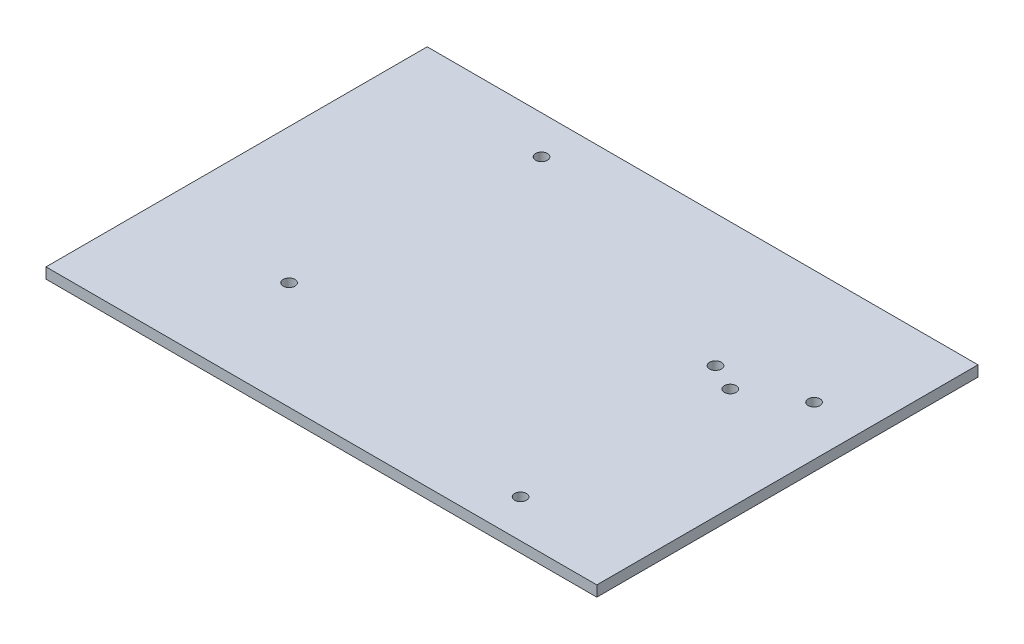
ISO-10303-21;
HEADER;
FILE_DESCRIPTION(('STEP AP214'),'2;1');
FILE_NAME('part.step','',(''),(''),'','','');
FILE_SCHEMA(('AUTOMOTIVE_DESIGN { 1 0 10303 214 1 1 1 1 }'));
ENDSEC;
DATA;
#1=APPLICATION_CONTEXT('core data for automotive mechanical design processes');
#2=APPLICATION_PROTOCOL_DEFINITION('international standard','automotive_design',2000,#1);
#3=PRODUCT_CONTEXT('',#1,'mechanical');
#4=PRODUCT('Part','Part','',(#3));
#5=PRODUCT_RELATED_PRODUCT_CATEGORY('part','',(#4));
#6=PRODUCT_DEFINITION_FORMATION('','',#4);
#7=PRODUCT_DEFINITION_CONTEXT('part definition',#1,'design');
#8=PRODUCT_DEFINITION('design','',#6,#7);
#9=PRODUCT_DEFINITION_SHAPE('','',#8);
#10=(LENGTH_UNIT() NAMED_UNIT(*) SI_UNIT(.MILLI.,.METRE.));
#11=(NAMED_UNIT(*) PLANE_ANGLE_UNIT() SI_UNIT($,.RADIAN.));
#12=(NAMED_UNIT(*) SI_UNIT($,.STERADIAN.) SOLID_ANGLE_UNIT());
#13=UNCERTAINTY_MEASURE_WITH_UNIT(LENGTH_MEASURE(1.E-05),#10,'distance_accuracy_value','');
#14=(GEOMETRIC_REPRESENTATION_CONTEXT(3) GLOBAL_UNCERTAINTY_ASSIGNED_CONTEXT((#13)) GLOBAL_UNIT_ASSIGNED_CONTEXT((#10,
#11,#12)) REPRESENTATION_CONTEXT('',''));
#15=CARTESIAN_POINT('',(0.,0.,0.));
#16=DIRECTION('',(0.,0.,1.));
#17=DIRECTION('',(1.,0.,0.));
#18=AXIS2_PLACEMENT_3D('',#15,#16,#17);
#19=CARTESIAN_POINT('',(0.,2.8,0.));
#20=DIRECTION('',(0.,-1.,0.));
#21=DIRECTION('',(0.,0.,-1.));
#22=AXIS2_PLACEMENT_3D('',#19,#20,#21);
#23=PLANE('',#22);
#24=CARTESIAN_POINT('',(37.9995377037068,2.8,-15.3809460939256));
#25=DIRECTION('',(0.,1.,0.));
#26=DIRECTION('',(0.,0.,1.));
#27=AXIS2_PLACEMENT_3D('',#24,#25,#26);
#28=CIRCLE('',#27,1.55);
#29=CARTESIAN_POINT('',(37.9995377037068,2.8,-13.8309460939256));
#30=VERTEX_POINT('',#29);
#31=EDGE_CURVE('E133',#30,#30,#28,.T.);
#32=ORIENTED_EDGE('',*,*,#31,.F.);
#33=EDGE_LOOP('',(#32));
#34=FACE_BOUND('',#33,.T.);
#35=CARTESIAN_POINT('',(45.25,2.8,-12.));
#36=DIRECTION('',(0.,1.,0.));
#37=DIRECTION('',(0.,0.,1.));
#38=AXIS2_PLACEMENT_3D('',#35,#36,#37);
#39=CIRCLE('',#38,1.55);
#40=CARTESIAN_POINT('',(45.25,2.8,-10.45));
#41=VERTEX_POINT('',#40);
#42=EDGE_CURVE('E139',#41,#41,#39,.T.);
#43=ORIENTED_EDGE('',*,*,#42,.F.);
#44=EDGE_LOOP('',(#43));
#45=FACE_BOUND('',#44,.T.);
#46=CARTESIAN_POINT('',(-36.75,2.8,21.73));
#47=DIRECTION('',(0.,1.,0.));
#48=DIRECTION('',(0.,0.,1.));
#49=AXIS2_PLACEMENT_3D('',#46,#47,#48);
#50=CIRCLE('',#49,1.55);
#51=CARTESIAN_POINT('',(-36.75,2.8,23.28));
#52=VERTEX_POINT('',#51);
#53=EDGE_CURVE('E127',#52,#52,#50,.T.);
#54=ORIENTED_EDGE('',*,*,#53,.F.);
#55=EDGE_LOOP('',(#54));
#56=FACE_BOUND('',#55,.T.);
#57=DIRECTION('',(0.,0.,-1.));
#58=VECTOR('',#57,1.);
#59=CARTESIAN_POINT('',(72.25,2.8,50.));
#60=LINE('',#59,#58);
#61=CARTESIAN_POINT('',(72.25,2.8,50.));
#62=VERTEX_POINT('',#61);
#63=CARTESIAN_POINT('',(72.25,2.8,-50.));
#64=VERTEX_POINT('',#63);
#65=EDGE_CURVE('E85',#62,#64,#60,.T.);
#66=ORIENTED_EDGE('',*,*,#65,.T.);
#67=DIRECTION('',(-1.,0.,0.));
#68=VECTOR('',#67,1.);
#69=CARTESIAN_POINT('',(-72.25,2.8,-50.));
#70=LINE('',#69,#68);
#71=CARTESIAN_POINT('',(-72.25,2.8,-50.));
#72=VERTEX_POINT('',#71);
#73=EDGE_CURVE('E80',#64,#72,#70,.T.);
#74=ORIENTED_EDGE('',*,*,#73,.T.);
#75=DIRECTION('',(0.,0.,1.));
#76=VECTOR('',#75,1.);
#77=CARTESIAN_POINT('',(-72.25,2.8,50.));
#78=LINE('',#77,#76);
#79=CARTESIAN_POINT('',(-72.25,2.8,50.));
#80=VERTEX_POINT('',#79);
#81=EDGE_CURVE('E83',#72,#80,#78,.T.);
#82=ORIENTED_EDGE('',*,*,#81,.T.);
#83=DIRECTION('',(1.,0.,0.));
#84=VECTOR('',#83,1.);
#85=CARTESIAN_POINT('',(-72.25,2.8,50.));
#86=LINE('',#85,#84);
#87=EDGE_CURVE('E50',#80,#62,#86,.T.);
#88=ORIENTED_EDGE('',*,*,#87,.T.);
#89=EDGE_LOOP('',(#66,#74,#82,#88));
#90=FACE_BOUND('',#89,.T.);
#91=CARTESIAN_POINT('',(-32.25,2.8,-40.));
#92=DIRECTION('',(0.,1.,0.));
#93=DIRECTION('',(0.,0.,1.));
#94=AXIS2_PLACEMENT_3D('',#91,#92,#93);
#95=CIRCLE('',#94,1.55);
#96=CARTESIAN_POINT('',(-32.25,2.8,-38.45));
#97=VERTEX_POINT('',#96);
#98=EDGE_CURVE('E100',#97,#97,#95,.T.);
#99=ORIENTED_EDGE('',*,*,#98,.F.);
#100=EDGE_LOOP('',(#99));
#101=FACE_BOUND('',#100,.T.);
#102=CARTESIAN_POINT('',(59.25,2.8,-20.));
#103=DIRECTION('',(0.,1.,0.));
#104=DIRECTION('',(0.,0.,1.));
#105=AXIS2_PLACEMENT_3D('',#102,#103,#104);
#106=CIRCLE('',#105,1.54999999999999);
#107=CARTESIAN_POINT('',(59.25,2.8,-18.45));
#108=VERTEX_POINT('',#107);
#109=EDGE_CURVE('E115',#108,#108,#106,.T.);
#110=ORIENTED_EDGE('',*,*,#109,.F.);
#111=EDGE_LOOP('',(#110));
#112=FACE_BOUND('',#111,.T.);
#113=CARTESIAN_POINT('',(42.25,2.8,40.));
#114=DIRECTION('',(0.,1.,0.));
#115=DIRECTION('',(0.,0.,1.));
#116=AXIS2_PLACEMENT_3D('',#113,#114,#115);
#117=CIRCLE('',#116,1.55);
#118=CARTESIAN_POINT('',(42.25,2.8,41.55));
#119=VERTEX_POINT('',#118);
#120=EDGE_CURVE('E121',#119,#119,#117,.T.);
#121=ORIENTED_EDGE('',*,*,#120,.F.);
#122=EDGE_LOOP('',(#121));
#123=FACE_BOUND('',#122,.T.);
#124=ADVANCED_FACE('F33',(#34,#45,#56,#90,#101,#112,#123),#23,.F.);
#125=CARTESIAN_POINT('',(0.,0.,0.));
#126=DIRECTION('',(0.,-1.,0.));
#127=DIRECTION('',(0.,0.,-1.));
#128=AXIS2_PLACEMENT_3D('',#125,#126,#127);
#129=PLANE('',#128);
#130=CARTESIAN_POINT('',(37.9995377037068,0.,-15.3809460939256));
#131=DIRECTION('',(0.,-1.,0.));
#132=DIRECTION('',(0.,0.,-1.));
#133=AXIS2_PLACEMENT_3D('',#130,#131,#132);
#134=CIRCLE('',#133,1.55);
#135=CARTESIAN_POINT('',(37.9995377037068,0.,-16.9309460939256));
#136=VERTEX_POINT('',#135);
#137=EDGE_CURVE('E142',#136,#136,#134,.F.);
#138=ORIENTED_EDGE('',*,*,#137,.T.);
#139=EDGE_LOOP('',(#138));
#140=FACE_BOUND('',#139,.T.);
#141=CARTESIAN_POINT('',(45.25,0.,-12.));
#142=DIRECTION('',(0.,-1.,0.));
#143=DIRECTION('',(0.,0.,-1.));
#144=AXIS2_PLACEMENT_3D('',#141,#142,#143);
#145=CIRCLE('',#144,1.55);
#146=CARTESIAN_POINT('',(45.25,0.,-13.55));
#147=VERTEX_POINT('',#146);
#148=EDGE_CURVE('E136',#147,#147,#145,.F.);
#149=ORIENTED_EDGE('',*,*,#148,.T.);
#150=EDGE_LOOP('',(#149));
#151=FACE_BOUND('',#150,.T.);
#152=CARTESIAN_POINT('',(-36.75,0.,21.73));
#153=DIRECTION('',(0.,-1.,0.));
#154=DIRECTION('',(0.,0.,-1.));
#155=AXIS2_PLACEMENT_3D('',#152,#153,#154);
#156=CIRCLE('',#155,1.55);
#157=CARTESIAN_POINT('',(-36.75,0.,20.18));
#158=VERTEX_POINT('',#157);
#159=EDGE_CURVE('E130',#158,#158,#156,.F.);
#160=ORIENTED_EDGE('',*,*,#159,.T.);
#161=EDGE_LOOP('',(#160));
#162=FACE_BOUND('',#161,.T.);
#163=CARTESIAN_POINT('',(59.25,0.,-20.));
#164=DIRECTION('',(0.,1.,0.));
#165=DIRECTION('',(0.,0.,1.));
#166=AXIS2_PLACEMENT_3D('',#163,#164,#165);
#167=CIRCLE('',#166,1.54999999999999);
#168=CARTESIAN_POINT('',(59.25,0.,-18.45));
#169=VERTEX_POINT('',#168);
#170=EDGE_CURVE('E118',#169,#169,#167,.T.);
#171=ORIENTED_EDGE('',*,*,#170,.T.);
#172=EDGE_LOOP('',(#171));
#173=FACE_BOUND('',#172,.T.);
#174=DIRECTION('',(0.,0.,-1.));
#175=VECTOR('',#174,1.);
#176=CARTESIAN_POINT('',(72.25,0.,50.));
#177=LINE('',#176,#175);
#178=CARTESIAN_POINT('',(72.25,0.,50.));
#179=VERTEX_POINT('',#178);
#180=CARTESIAN_POINT('',(72.25,0.,-50.));
#181=VERTEX_POINT('',#180);
#182=EDGE_CURVE('E97',#179,#181,#177,.T.);
#183=ORIENTED_EDGE('',*,*,#182,.F.);
#184=DIRECTION('',(1.,0.,0.));
#185=VECTOR('',#184,1.);
#186=CARTESIAN_POINT('',(-72.25,0.,50.));
#187=LINE('',#186,#185);
#188=CARTESIAN_POINT('',(-72.25,0.,50.));
#189=VERTEX_POINT('',#188);
#190=EDGE_CURVE('E73',#189,#179,#187,.T.);
#191=ORIENTED_EDGE('',*,*,#190,.F.);
#192=DIRECTION('',(0.,0.,1.));
#193=VECTOR('',#192,1.);
#194=CARTESIAN_POINT('',(-72.25,0.,50.));
#195=LINE('',#194,#193);
#196=CARTESIAN_POINT('',(-72.25,0.,-50.));
#197=VERTEX_POINT('',#196);
#198=EDGE_CURVE('E67',#197,#189,#195,.T.);
#199=ORIENTED_EDGE('',*,*,#198,.F.);
#200=DIRECTION('',(-1.,0.,0.));
#201=VECTOR('',#200,1.);
#202=CARTESIAN_POINT('',(-72.25,0.,-50.));
#203=LINE('',#202,#201);
#204=EDGE_CURVE('E89',#181,#197,#203,.T.);
#205=ORIENTED_EDGE('',*,*,#204,.F.);
#206=EDGE_LOOP('',(#183,#191,#199,#205));
#207=FACE_BOUND('',#206,.T.);
#208=CARTESIAN_POINT('',(-32.25,0.,-40.));
#209=DIRECTION('',(0.,1.,0.));
#210=DIRECTION('',(0.,0.,1.));
#211=AXIS2_PLACEMENT_3D('',#208,#209,#210);
#212=CIRCLE('',#211,1.55);
#213=CARTESIAN_POINT('',(-32.25,0.,-38.45));
#214=VERTEX_POINT('',#213);
#215=EDGE_CURVE('E112',#214,#214,#212,.T.);
#216=ORIENTED_EDGE('',*,*,#215,.T.);
#217=EDGE_LOOP('',(#216));
#218=FACE_BOUND('',#217,.T.);
#219=CARTESIAN_POINT('',(42.25,0.,40.));
#220=DIRECTION('',(0.,1.,0.));
#221=DIRECTION('',(0.,0.,1.));
#222=AXIS2_PLACEMENT_3D('',#219,#220,#221);
#223=CIRCLE('',#222,1.55);
#224=CARTESIAN_POINT('',(42.25,0.,41.55));
#225=VERTEX_POINT('',#224);
#226=EDGE_CURVE('E124',#225,#225,#223,.T.);
#227=ORIENTED_EDGE('',*,*,#226,.T.);
#228=EDGE_LOOP('',(#227));
#229=FACE_BOUND('',#228,.T.);
#230=ADVANCED_FACE('F108',(#140,#151,#162,#173,#207,#218,#229),#129,.T.);
#231=CARTESIAN_POINT('',(72.25,2.8,50.));
#232=DIRECTION('',(-1.,0.,0.));
#233=DIRECTION('',(0.,0.,1.));
#234=AXIS2_PLACEMENT_3D('',#231,#232,#233);
#235=PLANE('',#234);
#236=ORIENTED_EDGE('',*,*,#182,.T.);
#237=DIRECTION('',(0.,-1.,0.));
#238=VECTOR('',#237,1.);
#239=CARTESIAN_POINT('',(72.25,2.8,-50.));
#240=LINE('',#239,#238);
#241=EDGE_CURVE('E11',#64,#181,#240,.T.);
#242=ORIENTED_EDGE('',*,*,#241,.F.);
#243=ORIENTED_EDGE('',*,*,#65,.F.);
#244=DIRECTION('',(0.,-1.,0.));
#245=VECTOR('',#244,1.);
#246=CARTESIAN_POINT('',(72.25,2.8,50.));
#247=LINE('',#246,#245);
#248=EDGE_CURVE('E93',#62,#179,#247,.T.);
#249=ORIENTED_EDGE('',*,*,#248,.T.);
#250=EDGE_LOOP('',(#236,#242,#243,#249));
#251=FACE_BOUND('',#250,.T.);
#252=ADVANCED_FACE('F35',(#251),#235,.F.);
#253=CARTESIAN_POINT('',(-72.25,2.8,-50.));
#254=DIRECTION('',(0.,0.,1.));
#255=DIRECTION('',(1.,0.,0.));
#256=AXIS2_PLACEMENT_3D('',#253,#254,#255);
#257=PLANE('',#256);
#258=ORIENTED_EDGE('',*,*,#204,.T.);
#259=DIRECTION('',(0.,-1.,0.));
#260=VECTOR('',#259,1.);
#261=CARTESIAN_POINT('',(-72.25,2.8,-50.));
#262=LINE('',#261,#260);
#263=EDGE_CURVE('E42',#72,#197,#262,.T.);
#264=ORIENTED_EDGE('',*,*,#263,.F.);
#265=ORIENTED_EDGE('',*,*,#73,.F.);
#266=ORIENTED_EDGE('',*,*,#241,.T.);
#267=EDGE_LOOP('',(#258,#264,#265,#266));
#268=FACE_BOUND('',#267,.T.);
#269=ADVANCED_FACE('F88',(#268),#257,.F.);
#270=CARTESIAN_POINT('',(-72.25,2.8,50.));
#271=DIRECTION('',(1.,0.,0.));
#272=DIRECTION('',(0.,0.,-1.));
#273=AXIS2_PLACEMENT_3D('',#270,#271,#272);
#274=PLANE('',#273);
#275=ORIENTED_EDGE('',*,*,#198,.T.);
#276=DIRECTION('',(0.,-1.,0.));
#277=VECTOR('',#276,1.);
#278=CARTESIAN_POINT('',(-72.25,2.8,50.));
#279=LINE('',#278,#277);
#280=EDGE_CURVE('E90',#80,#189,#279,.T.);
#281=ORIENTED_EDGE('',*,*,#280,.F.);
#282=ORIENTED_EDGE('',*,*,#81,.F.);
#283=ORIENTED_EDGE('',*,*,#263,.T.);
#284=EDGE_LOOP('',(#275,#281,#282,#283));
#285=FACE_BOUND('',#284,.T.);
#286=ADVANCED_FACE('F91',(#285),#274,.F.);
#287=CARTESIAN_POINT('',(-72.25,2.8,50.));
#288=DIRECTION('',(0.,0.,-1.));
#289=DIRECTION('',(-1.,0.,0.));
#290=AXIS2_PLACEMENT_3D('',#287,#288,#289);
#291=PLANE('',#290);
#292=ORIENTED_EDGE('',*,*,#190,.T.);
#293=ORIENTED_EDGE('',*,*,#248,.F.);
#294=ORIENTED_EDGE('',*,*,#87,.F.);
#295=ORIENTED_EDGE('',*,*,#280,.T.);
#296=EDGE_LOOP('',(#292,#293,#294,#295));
#297=FACE_BOUND('',#296,.T.);
#298=ADVANCED_FACE('F105',(#297),#291,.F.);
#299=CARTESIAN_POINT('',(-32.25,2.8,-40.));
#300=DIRECTION('',(0.,-1.,0.));
#301=DIRECTION('',(0.,0.,-1.));
#302=AXIS2_PLACEMENT_3D('',#299,#300,#301);
#303=CYLINDRICAL_SURFACE('',#302,1.55);
#304=ORIENTED_EDGE('',*,*,#98,.T.);
#305=EDGE_LOOP('',(#304));
#306=FACE_BOUND('',#305,.T.);
#307=ORIENTED_EDGE('',*,*,#215,.F.);
#308=EDGE_LOOP('',(#307));
#309=FACE_BOUND('',#308,.T.);
#310=ADVANCED_FACE('F177',(#306,#309),#303,.F.);
#311=CARTESIAN_POINT('',(59.25,2.8,-20.));
#312=DIRECTION('',(0.,-1.,0.));
#313=DIRECTION('',(0.,0.,-1.));
#314=AXIS2_PLACEMENT_3D('',#311,#312,#313);
#315=CYLINDRICAL_SURFACE('',#314,1.54999999999999);
#316=ORIENTED_EDGE('',*,*,#109,.T.);
#317=EDGE_LOOP('',(#316));
#318=FACE_BOUND('',#317,.T.);
#319=ORIENTED_EDGE('',*,*,#170,.F.);
#320=EDGE_LOOP('',(#319));
#321=FACE_BOUND('',#320,.T.);
#322=ADVANCED_FACE('F169',(#318,#321),#315,.F.);
#323=CARTESIAN_POINT('',(42.25,2.8,40.));
#324=DIRECTION('',(0.,-1.,0.));
#325=DIRECTION('',(0.,0.,-1.));
#326=AXIS2_PLACEMENT_3D('',#323,#324,#325);
#327=CYLINDRICAL_SURFACE('',#326,1.55);
#328=ORIENTED_EDGE('',*,*,#120,.T.);
#329=EDGE_LOOP('',(#328));
#330=FACE_BOUND('',#329,.T.);
#331=ORIENTED_EDGE('',*,*,#226,.F.);
#332=EDGE_LOOP('',(#331));
#333=FACE_BOUND('',#332,.T.);
#334=ADVANCED_FACE('F160',(#330,#333),#327,.F.);
#335=CARTESIAN_POINT('',(-36.75,-0.00100000000000013,21.73));
#336=DIRECTION('',(0.,1.,0.));
#337=DIRECTION('',(0.,0.,1.));
#338=AXIS2_PLACEMENT_3D('',#335,#336,#337);
#339=CYLINDRICAL_SURFACE('',#338,1.55);
#340=ORIENTED_EDGE('',*,*,#159,.F.);
#341=EDGE_LOOP('',(#340));
#342=FACE_BOUND('',#341,.T.);
#343=ORIENTED_EDGE('',*,*,#53,.T.);
#344=EDGE_LOOP('',(#343));
#345=FACE_BOUND('',#344,.T.);
#346=ADVANCED_FACE('F157',(#342,#345),#339,.F.);
#347=CARTESIAN_POINT('',(45.25,-0.00100000000000013,-12.));
#348=DIRECTION('',(0.,1.,0.));
#349=DIRECTION('',(0.,0.,1.));
#350=AXIS2_PLACEMENT_3D('',#347,#348,#349);
#351=CYLINDRICAL_SURFACE('',#350,1.55);
#352=ORIENTED_EDGE('',*,*,#148,.F.);
#353=EDGE_LOOP('',(#352));
#354=FACE_BOUND('',#353,.T.);
#355=ORIENTED_EDGE('',*,*,#42,.T.);
#356=EDGE_LOOP('',(#355));
#357=FACE_BOUND('',#356,.T.);
#358=ADVANCED_FACE('F159',(#354,#357),#351,.F.);
#359=CARTESIAN_POINT('',(37.9995377037068,-0.00100000000000013,-15.3809460939256));
#360=DIRECTION('',(0.,1.,0.));
#361=DIRECTION('',(0.,0.,1.));
#362=AXIS2_PLACEMENT_3D('',#359,#360,#361);
#363=CYLINDRICAL_SURFACE('',#362,1.55);
#364=ORIENTED_EDGE('',*,*,#137,.F.);
#365=EDGE_LOOP('',(#364));
#366=FACE_BOUND('',#365,.T.);
#367=ORIENTED_EDGE('',*,*,#31,.T.);
#368=EDGE_LOOP('',(#367));
#369=FACE_BOUND('',#368,.T.);
#370=ADVANCED_FACE('F148',(#366,#369),#363,.F.);
#371=CLOSED_SHELL('',(#124,#230,#252,#269,#286,#298,#310,#322,#334,#346,#358,#370));
#372=MANIFOLD_SOLID_BREP('B2',#371);
#373=ADVANCED_BREP_SHAPE_REPRESENTATION('',(#18,#372),#14);
#374=SHAPE_DEFINITION_REPRESENTATION(#9,#373);
ENDSEC;
END-ISO-10303-21;
